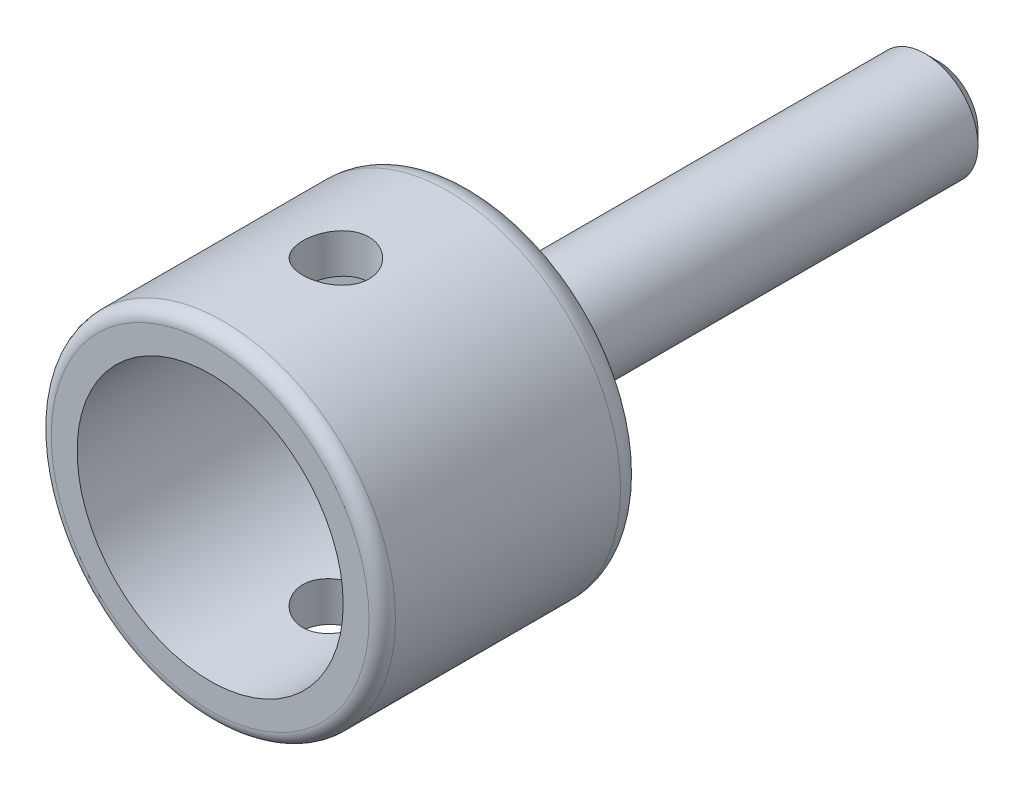
ISO-10303-21;
HEADER;
FILE_DESCRIPTION(('STEP AP214'),'2;1');
FILE_NAME('part.step','',(''),(''),'','','');
FILE_SCHEMA(('AUTOMOTIVE_DESIGN { 1 0 10303 214 1 1 1 1 }'));
ENDSEC;
DATA;
#1=APPLICATION_CONTEXT('core data for automotive mechanical design processes');
#2=APPLICATION_PROTOCOL_DEFINITION('international standard','automotive_design',2000,#1);
#3=PRODUCT_CONTEXT('',#1,'mechanical');
#4=PRODUCT('Part','Part','',(#3));
#5=PRODUCT_RELATED_PRODUCT_CATEGORY('part','',(#4));
#6=PRODUCT_DEFINITION_FORMATION('','',#4);
#7=PRODUCT_DEFINITION_CONTEXT('part definition',#1,'design');
#8=PRODUCT_DEFINITION('design','',#6,#7);
#9=PRODUCT_DEFINITION_SHAPE('','',#8);
#10=(LENGTH_UNIT() NAMED_UNIT(*) SI_UNIT(.MILLI.,.METRE.));
#11=(NAMED_UNIT(*) PLANE_ANGLE_UNIT() SI_UNIT($,.RADIAN.));
#12=(NAMED_UNIT(*) SI_UNIT($,.STERADIAN.) SOLID_ANGLE_UNIT());
#13=UNCERTAINTY_MEASURE_WITH_UNIT(LENGTH_MEASURE(1.E-05),#10,'distance_accuracy_value','');
#14=(GEOMETRIC_REPRESENTATION_CONTEXT(3) GLOBAL_UNCERTAINTY_ASSIGNED_CONTEXT((#13)) GLOBAL_UNIT_ASSIGNED_CONTEXT((#10,
#11,#12)) REPRESENTATION_CONTEXT('',''));
#15=CARTESIAN_POINT('',(0.,0.,0.));
#16=DIRECTION('',(0.,0.,1.));
#17=DIRECTION('',(1.,0.,0.));
#18=AXIS2_PLACEMENT_3D('',#15,#16,#17);
#19=CARTESIAN_POINT('',(0.,0.,20.));
#20=DIRECTION('',(0.,0.,-1.));
#21=DIRECTION('',(-1.,0.,0.));
#22=AXIS2_PLACEMENT_3D('',#19,#20,#21);
#23=CYLINDRICAL_SURFACE('',#22,13.);
#24=CARTESIAN_POINT('',(0.,-13.,13.));
#25=CARTESIAN_POINT('',(0.139052660180754,-12.9999974610984,12.9999947587803));
#26=CARTESIAN_POINT('',(0.278172773072155,-12.9977459806996,12.988359412702));
#27=CARTESIAN_POINT('',(0.552488133091361,-12.9889814495606,12.9421580551378));
#28=CARTESIAN_POINT('',(0.687680044894599,-12.9824648818705,12.907573119314));
#29=CARTESIAN_POINT('',(0.950132537462372,-12.9658986493339,12.8165744195119));
#30=CARTESIAN_POINT('',(1.07740031971374,-12.9558522492613,12.7601808217264));
#31=CARTESIAN_POINT('',(1.32065723842359,-12.9333215487838,12.6272238720737));
#32=CARTESIAN_POINT('',(1.43664719548844,-12.9208374259537,12.5506619892138));
#33=CARTESIAN_POINT('',(1.65552432974222,-12.8946323002435,12.3785208342922));
#34=CARTESIAN_POINT('',(1.75824929536754,-12.8808989548617,12.2827371685489));
#35=CARTESIAN_POINT('',(1.94627668615617,-12.8538341361733,12.0753109628053));
#36=CARTESIAN_POINT('',(2.03157781945352,-12.8405026927278,11.9636672479234));
#37=CARTESIAN_POINT('',(2.18301679620621,-12.8156309401952,11.7265360046422));
#38=CARTESIAN_POINT('',(2.24898851450226,-12.8041065326509,11.6009405688997));
#39=CARTESIAN_POINT('',(2.35883220315187,-12.7843281256073,11.3401900899734));
#40=CARTESIAN_POINT('',(2.40270618335278,-12.7760738286974,11.2050359174576));
#41=CARTESIAN_POINT('',(2.46658610457138,-12.7638947012764,10.9307438082808));
#42=CARTESIAN_POINT('',(2.48687558791542,-12.7599184822057,10.7916742333029));
#43=CARTESIAN_POINT('',(2.50389090184761,-12.7565908775945,10.51205236308));
#44=CARTESIAN_POINT('',(2.50061895687192,-12.7572390554642,10.3715002090564));
#45=CARTESIAN_POINT('',(2.47083395608554,-12.763040258418,10.0949647768379));
#46=CARTESIAN_POINT('',(2.44464430650054,-12.7681305946622,9.95894515523523));
#47=CARTESIAN_POINT('',(2.37027708135778,-12.7821440039021,9.69326701688442));
#48=CARTESIAN_POINT('',(2.32209852760331,-12.7910672474073,9.56360878341274));
#49=CARTESIAN_POINT('',(2.20480765459312,-12.8118060352358,9.31339305618049));
#50=CARTESIAN_POINT('',(2.13556565597228,-12.8236394070727,9.19289788949199));
#51=CARTESIAN_POINT('',(1.97820505089348,-12.848853471063,8.96511502886143));
#52=CARTESIAN_POINT('',(1.89008443268647,-12.8622343280499,8.85782874440831));
#53=CARTESIAN_POINT('',(1.69572891132668,-12.889308238097,8.65764146577918));
#54=CARTESIAN_POINT('',(1.58921761155993,-12.9030027865394,8.5650088099632));
#55=CARTESIAN_POINT('',(1.36202665615399,-12.9289572102898,8.39888449269947));
#56=CARTESIAN_POINT('',(1.24134684412448,-12.9412170697587,8.32539304255885));
#57=CARTESIAN_POINT('',(0.988957762488794,-12.9629474861032,8.19959395296034));
#58=CARTESIAN_POINT('',(0.857233713043068,-12.9724142260635,8.14731526538283));
#59=CARTESIAN_POINT('',(0.586650569197115,-12.9874624721642,8.06570257665309));
#60=CARTESIAN_POINT('',(0.447792274642338,-12.993044412827,8.03636600933479));
#61=CARTESIAN_POINT('',(0.169189915144616,-12.9996341283048,8.00184623384643));
#62=CARTESIAN_POINT('',(0.0294929779953189,-13.0007114935454,7.99629552815895));
#63=CARTESIAN_POINT('',(-0.248832636592824,-12.9983632998844,8.00851777719664));
#64=CARTESIAN_POINT('',(-0.387461368986751,-12.994937974206,8.02628952390234));
#65=CARTESIAN_POINT('',(-0.658542242580223,-12.9840126871957,8.08434674399503));
#66=CARTESIAN_POINT('',(-0.791035903724995,-12.976546573136,8.12444527842575));
#67=CARTESIAN_POINT('',(-1.0474195560019,-12.9583735448858,8.22581478012444));
#68=CARTESIAN_POINT('',(-1.1713089389197,-12.9476664018813,8.28708724229727));
#69=CARTESIAN_POINT('',(-1.40852868267246,-12.924025465347,8.42987174317475));
#70=CARTESIAN_POINT('',(-1.52172218526331,-12.9110676225358,8.51160709153679));
#71=CARTESIAN_POINT('',(-1.73291860543103,-12.8844225517876,8.69269622349735));
#72=CARTESIAN_POINT('',(-1.83092002380893,-12.8707352520445,8.79205174383397));
#73=CARTESIAN_POINT('',(-2.01035510164863,-12.8439416383922,9.00722816139603));
#74=CARTESIAN_POINT('',(-2.09153739238512,-12.8308461515727,9.12326025028297));
#75=CARTESIAN_POINT('',(-2.23325948833318,-12.8069410375943,9.36753032427334));
#76=CARTESIAN_POINT('',(-2.29380008432373,-12.7961313228739,9.49576784154856));
#77=CARTESIAN_POINT('',(-2.39216884187718,-12.7781075731774,9.76018635894623));
#78=CARTESIAN_POINT('',(-2.43010977595278,-12.770875715852,9.89632413346754));
#79=CARTESIAN_POINT('',(-2.48254790543446,-12.7607868732141,10.1731950732065));
#80=CARTESIAN_POINT('',(-2.49704789991889,-12.7579293655635,10.3139276877074));
#81=CARTESIAN_POINT('',(-2.50209511687348,-12.7569402050647,10.5934733559216));
#82=CARTESIAN_POINT('',(-2.49303910212208,-12.7587302704385,10.7322791229674));
#83=CARTESIAN_POINT('',(-2.45210266538041,-12.7666604796616,11.0063499445064));
#84=CARTESIAN_POINT('',(-2.42022239691185,-12.7728005942514,11.1416150228088));
#85=CARTESIAN_POINT('',(-2.33471347717499,-12.7887053259627,11.404536619842));
#86=CARTESIAN_POINT('',(-2.28112994200388,-12.7984624206699,11.5322082959176));
#87=CARTESIAN_POINT('',(-2.15377970785528,-12.8205066533974,11.7768123618909));
#88=CARTESIAN_POINT('',(-2.08001148134918,-12.8327939828824,11.8937439381089));
#89=CARTESIAN_POINT('',(-1.91301563814429,-12.8587559030274,12.1155315746846));
#90=CARTESIAN_POINT('',(-1.81950009853846,-12.8724492796511,12.2201686814821));
#91=CARTESIAN_POINT('',(-1.61626238485009,-12.8995420316146,12.4123973754943));
#92=CARTESIAN_POINT('',(-1.50653649326075,-12.9129413387038,12.4999850420681));
#93=CARTESIAN_POINT('',(-1.27273625734663,-12.9380865705891,12.6564130168556));
#94=CARTESIAN_POINT('',(-1.14853493486942,-12.9498154901243,12.7250663700691));
#95=CARTESIAN_POINT('',(-0.890172259350415,-12.9701319076699,12.8404207923641));
#96=CARTESIAN_POINT('',(-0.756020253294858,-12.9787223099363,12.8871421678689));
#97=CARTESIAN_POINT('',(-0.517923565705546,-12.9900734375022,12.9479845842146));
#98=CARTESIAN_POINT('',(-0.415357439701677,-12.9937745900334,12.9674564897523));
#99=CARTESIAN_POINT('',(-0.208540158514685,-12.9987387895389,12.993465983637));
#100=CARTESIAN_POINT('',(-0.104289050170327,-13.0000019041681,13.000003930898));
#101=CARTESIAN_POINT('',(0.,-13.,13.));
#102=B_SPLINE_CURVE_WITH_KNOTS('',3,(#24,#25,#26,#27,#28,#29,#30,#31,#32,#33,#34,#35,#36,#37,
#38,#39,#40,#41,#42,#43,#44,#45,#46,#47,#48,#49,#50,#51,#52,#53,#54,#55,#56,#57,#58,#59,#60,#61,
#62,#63,#64,#65,#66,#67,#68,#69,#70,#71,#72,#73,#74,#75,#76,#77,#78,#79,#80,#81,#82,#83,#84,#85,
#86,#87,#88,#89,#90,#91,#92,#93,#94,#95,#96,#97,#98,#99,#100,#101),.UNSPECIFIED.,.T.,.F.,(4,2,2,
2,2,2,2,2,2,2,2,2,2,2,2,2,2,2,2,2,2,2,2,2,2,2,2,2,2,2,2,2,2,2,2,2,2,2,4),(0.,0.416776540572571,
0.833897184796517,1.25063304157329,1.66733855274582,2.08873532404099,2.51016332788524,
2.93511361824241,3.36002525127149,3.77977378984828,4.19948270045458,4.61336264699441,
5.02726100716069,5.44376099870308,5.86030539553681,6.28376393575654,6.70722715049957,
7.13126639340045,7.55525819906331,7.9726750569953,8.3900702950831,8.80402218494166,
9.21800330627654,9.63671570954056,10.0554694062924,10.480090247665,10.9046948200739,
11.3271624654498,11.7495796603136,12.1649281712355,12.5802738884444,12.9947605928499,
13.4092786732858,13.8303190431965,14.2514561202698,14.6766136027338,15.1013766593073,
15.4139664054683,15.7265474772226),.UNSPECIFIED.);
#103=CARTESIAN_POINT('',(0.,-13.,13.));
#104=VERTEX_POINT('',#103);
#105=EDGE_CURVE('E91',#104,#104,#102,.T.);
#106=ORIENTED_EDGE('',*,*,#105,.T.);
#107=EDGE_LOOP('',(#106));
#108=FACE_BOUND('',#107,.T.);
#109=CARTESIAN_POINT('',(0.,13.,13.));
#110=CARTESIAN_POINT('',(-0.139052660180754,12.9999974610984,12.9999947587803));
#111=CARTESIAN_POINT('',(-0.278172773072155,12.9977459806996,12.988359412702));
#112=CARTESIAN_POINT('',(-0.552488133091361,12.9889814495606,12.9421580551378));
#113=CARTESIAN_POINT('',(-0.687680044894599,12.9824648818705,12.907573119314));
#114=CARTESIAN_POINT('',(-0.950132537462372,12.9658986493339,12.8165744195119));
#115=CARTESIAN_POINT('',(-1.07740031971374,12.9558522492613,12.7601808217264));
#116=CARTESIAN_POINT('',(-1.32065723842359,12.9333215487838,12.6272238720737));
#117=CARTESIAN_POINT('',(-1.43664719548844,12.9208374259537,12.5506619892138));
#118=CARTESIAN_POINT('',(-1.65552432974222,12.8946323002435,12.3785208342922));
#119=CARTESIAN_POINT('',(-1.75824929536754,12.8808989548617,12.2827371685489));
#120=CARTESIAN_POINT('',(-1.94627668615617,12.8538341361733,12.0753109628053));
#121=CARTESIAN_POINT('',(-2.03157781945352,12.8405026927278,11.9636672479234));
#122=CARTESIAN_POINT('',(-2.18301679620621,12.8156309401952,11.7265360046422));
#123=CARTESIAN_POINT('',(-2.24898851450226,12.8041065326509,11.6009405688997));
#124=CARTESIAN_POINT('',(-2.35883220315187,12.7843281256073,11.3401900899734));
#125=CARTESIAN_POINT('',(-2.40270618335278,12.7760738286974,11.2050359174576));
#126=CARTESIAN_POINT('',(-2.46658610457138,12.7638947012764,10.9307438082808));
#127=CARTESIAN_POINT('',(-2.48687558791542,12.7599184822057,10.7916742333029));
#128=CARTESIAN_POINT('',(-2.50389090184761,12.7565908775945,10.51205236308));
#129=CARTESIAN_POINT('',(-2.50061895687192,12.7572390554642,10.3715002090564));
#130=CARTESIAN_POINT('',(-2.47083395608554,12.763040258418,10.0949647768379));
#131=CARTESIAN_POINT('',(-2.44464430650054,12.7681305946622,9.95894515523523));
#132=CARTESIAN_POINT('',(-2.37027708135778,12.7821440039021,9.69326701688442));
#133=CARTESIAN_POINT('',(-2.32209852760331,12.7910672474073,9.56360878341274));
#134=CARTESIAN_POINT('',(-2.20480765459312,12.8118060352358,9.31339305618049));
#135=CARTESIAN_POINT('',(-2.13556565597228,12.8236394070727,9.19289788949199));
#136=CARTESIAN_POINT('',(-1.97820505089348,12.848853471063,8.96511502886143));
#137=CARTESIAN_POINT('',(-1.89008443268647,12.8622343280499,8.85782874440831));
#138=CARTESIAN_POINT('',(-1.69572891132668,12.889308238097,8.65764146577918));
#139=CARTESIAN_POINT('',(-1.58921761155993,12.9030027865394,8.5650088099632));
#140=CARTESIAN_POINT('',(-1.36202665615399,12.9289572102898,8.39888449269947));
#141=CARTESIAN_POINT('',(-1.24134684412448,12.9412170697587,8.32539304255885));
#142=CARTESIAN_POINT('',(-0.988957762488794,12.9629474861032,8.19959395296034));
#143=CARTESIAN_POINT('',(-0.857233713043068,12.9724142260635,8.14731526538283));
#144=CARTESIAN_POINT('',(-0.586650569197115,12.9874624721642,8.06570257665309));
#145=CARTESIAN_POINT('',(-0.447792274642338,12.993044412827,8.03636600933479));
#146=CARTESIAN_POINT('',(-0.169189915144616,12.9996341283048,8.00184623384643));
#147=CARTESIAN_POINT('',(-0.0294929779953189,13.0007114935454,7.99629552815895));
#148=CARTESIAN_POINT('',(0.248832636592824,12.9983632998844,8.00851777719664));
#149=CARTESIAN_POINT('',(0.387461368986751,12.994937974206,8.02628952390234));
#150=CARTESIAN_POINT('',(0.658542242580223,12.9840126871957,8.08434674399503));
#151=CARTESIAN_POINT('',(0.791035903724995,12.976546573136,8.12444527842575));
#152=CARTESIAN_POINT('',(1.0474195560019,12.9583735448858,8.22581478012444));
#153=CARTESIAN_POINT('',(1.1713089389197,12.9476664018813,8.28708724229727));
#154=CARTESIAN_POINT('',(1.40852868267246,12.924025465347,8.42987174317475));
#155=CARTESIAN_POINT('',(1.52172218526331,12.9110676225358,8.51160709153679));
#156=CARTESIAN_POINT('',(1.73291860543103,12.8844225517876,8.69269622349735));
#157=CARTESIAN_POINT('',(1.83092002380893,12.8707352520445,8.79205174383397));
#158=CARTESIAN_POINT('',(2.01035510164863,12.8439416383922,9.00722816139603));
#159=CARTESIAN_POINT('',(2.09153739238512,12.8308461515727,9.12326025028297));
#160=CARTESIAN_POINT('',(2.23325948833318,12.8069410375943,9.36753032427334));
#161=CARTESIAN_POINT('',(2.29380008432373,12.7961313228739,9.49576784154856));
#162=CARTESIAN_POINT('',(2.39216884187718,12.7781075731774,9.76018635894623));
#163=CARTESIAN_POINT('',(2.43010977595278,12.770875715852,9.89632413346754));
#164=CARTESIAN_POINT('',(2.48254790543446,12.7607868732141,10.1731950732065));
#165=CARTESIAN_POINT('',(2.49704789991889,12.7579293655635,10.3139276877074));
#166=CARTESIAN_POINT('',(2.50209511687348,12.7569402050647,10.5934733559216));
#167=CARTESIAN_POINT('',(2.49303910212208,12.7587302704385,10.7322791229674));
#168=CARTESIAN_POINT('',(2.45210266538041,12.7666604796616,11.0063499445064));
#169=CARTESIAN_POINT('',(2.42022239691185,12.7728005942514,11.1416150228088));
#170=CARTESIAN_POINT('',(2.33471347717499,12.7887053259627,11.404536619842));
#171=CARTESIAN_POINT('',(2.28112994200388,12.7984624206699,11.5322082959176));
#172=CARTESIAN_POINT('',(2.15377970785528,12.8205066533974,11.7768123618909));
#173=CARTESIAN_POINT('',(2.08001148134918,12.8327939828824,11.8937439381089));
#174=CARTESIAN_POINT('',(1.91301563814429,12.8587559030274,12.1155315746846));
#175=CARTESIAN_POINT('',(1.81950009853846,12.8724492796511,12.2201686814821));
#176=CARTESIAN_POINT('',(1.61626238485009,12.8995420316146,12.4123973754943));
#177=CARTESIAN_POINT('',(1.50653649326075,12.9129413387038,12.4999850420681));
#178=CARTESIAN_POINT('',(1.27273625734663,12.9380865705891,12.6564130168556));
#179=CARTESIAN_POINT('',(1.14853493486942,12.9498154901243,12.7250663700691));
#180=CARTESIAN_POINT('',(0.890172259350415,12.9701319076699,12.8404207923641));
#181=CARTESIAN_POINT('',(0.756020253294858,12.9787223099363,12.8871421678689));
#182=CARTESIAN_POINT('',(0.517923565705546,12.9900734375022,12.9479845842146));
#183=CARTESIAN_POINT('',(0.415357439701677,12.9937745900334,12.9674564897523));
#184=CARTESIAN_POINT('',(0.208540158514685,12.9987387895389,12.993465983637));
#185=CARTESIAN_POINT('',(0.104289050170327,13.0000019041681,13.000003930898));
#186=CARTESIAN_POINT('',(0.,13.,13.));
#187=B_SPLINE_CURVE_WITH_KNOTS('',3,(#109,#110,#111,#112,#113,#114,#115,#116,#117,#118,#119,
#120,#121,#122,#123,#124,#125,#126,#127,#128,#129,#130,#131,#132,#133,#134,#135,#136,#137,#138,
#139,#140,#141,#142,#143,#144,#145,#146,#147,#148,#149,#150,#151,#152,#153,#154,#155,#156,#157,
#158,#159,#160,#161,#162,#163,#164,#165,#166,#167,#168,#169,#170,#171,#172,#173,#174,#175,#176,
#177,#178,#179,#180,#181,#182,#183,#184,#185,#186),.UNSPECIFIED.,.T.,.F.,(4,2,2,2,2,2,2,2,2,2,2,
2,2,2,2,2,2,2,2,2,2,2,2,2,2,2,2,2,2,2,2,2,2,2,2,2,2,2,4),(0.,0.416776540572571,
0.833897184796517,1.25063304157329,1.66733855274582,2.08873532404099,2.51016332788524,
2.93511361824241,3.36002525127149,3.77977378984828,4.19948270045458,4.61336264699441,
5.02726100716069,5.44376099870308,5.86030539553681,6.28376393575654,6.70722715049957,
7.13126639340045,7.55525819906331,7.9726750569953,8.3900702950831,8.80402218494166,
9.21800330627654,9.63671570954056,10.0554694062924,10.480090247665,10.9046948200739,
11.3271624654498,11.7495796603136,12.1649281712355,12.5802738884444,12.9947605928499,
13.4092786732858,13.8303190431965,14.2514561202698,14.6766136027338,15.1013766593073,
15.4139664054683,15.7265474772226),.UNSPECIFIED.);
#188=CARTESIAN_POINT('',(0.,13.,13.));
#189=VERTEX_POINT('',#188);
#190=EDGE_CURVE('E84',#189,#189,#187,.T.);
#191=ORIENTED_EDGE('',*,*,#190,.T.);
#192=EDGE_LOOP('',(#191));
#193=FACE_BOUND('',#192,.T.);
#194=CARTESIAN_POINT('',(0.,0.,19.));
#195=DIRECTION('',(0.,0.,1.));
#196=DIRECTION('',(1.,0.,0.));
#197=AXIS2_PLACEMENT_3D('',#194,#195,#196);
#198=CIRCLE('',#197,13.);
#199=CARTESIAN_POINT('',(13.,0.,19.));
#200=VERTEX_POINT('',#199);
#201=EDGE_CURVE('E10',#200,#200,#198,.F.);
#202=ORIENTED_EDGE('',*,*,#201,.T.);
#203=EDGE_LOOP('',(#202));
#204=FACE_BOUND('',#203,.T.);
#205=CARTESIAN_POINT('',(0.,0.,2.));
#206=DIRECTION('',(0.,0.,1.));
#207=DIRECTION('',(1.,0.,0.));
#208=AXIS2_PLACEMENT_3D('',#205,#206,#207);
#209=CIRCLE('',#208,13.);
#210=CARTESIAN_POINT('',(13.,0.,2.));
#211=VERTEX_POINT('',#210);
#212=EDGE_CURVE('E129',#211,#211,#209,.T.);
#213=ORIENTED_EDGE('',*,*,#212,.T.);
#214=EDGE_LOOP('',(#213));
#215=FACE_BOUND('',#214,.T.);
#216=ADVANCED_FACE('F38',(#108,#193,#204,#215),#23,.T.);
#217=CARTESIAN_POINT('',(0.,0.,20.));
#218=DIRECTION('',(0.,0.,1.));
#219=DIRECTION('',(1.,0.,0.));
#220=AXIS2_PLACEMENT_3D('',#217,#218,#219);
#221=PLANE('',#220);
#222=CARTESIAN_POINT('',(0.,0.,20.));
#223=DIRECTION('',(0.,0.,1.));
#224=DIRECTION('',(1.,0.,0.));
#225=AXIS2_PLACEMENT_3D('',#222,#223,#224);
#226=CIRCLE('',#225,12.);
#227=CARTESIAN_POINT('',(12.,0.,20.));
#228=VERTEX_POINT('',#227);
#229=EDGE_CURVE('E52',#228,#228,#226,.T.);
#230=ORIENTED_EDGE('',*,*,#229,.T.);
#231=EDGE_LOOP('',(#230));
#232=FACE_BOUND('',#231,.T.);
#233=CARTESIAN_POINT('',(0.,0.,20.));
#234=DIRECTION('',(0.,0.,1.));
#235=DIRECTION('',(1.,0.,0.));
#236=AXIS2_PLACEMENT_3D('',#233,#234,#235);
#237=CIRCLE('',#236,10.05);
#238=CARTESIAN_POINT('',(10.05,0.,20.));
#239=VERTEX_POINT('',#238);
#240=EDGE_CURVE('E149',#239,#239,#237,.T.);
#241=ORIENTED_EDGE('',*,*,#240,.F.);
#242=EDGE_LOOP('',(#241));
#243=FACE_BOUND('',#242,.T.);
#244=ADVANCED_FACE('F100',(#232,#243),#221,.T.);
#245=CARTESIAN_POINT('',(0.,0.,0.));
#246=DIRECTION('',(0.,0.,1.));
#247=DIRECTION('',(1.,0.,0.));
#248=AXIS2_PLACEMENT_3D('',#245,#246,#247);
#249=PLANE('',#248);
#250=CARTESIAN_POINT('',(0.,0.,0.));
#251=DIRECTION('',(0.,0.,1.));
#252=DIRECTION('',(1.,0.,0.));
#253=AXIS2_PLACEMENT_3D('',#250,#251,#252);
#254=CIRCLE('',#253,6.);
#255=CARTESIAN_POINT('',(6.,0.,0.));
#256=VERTEX_POINT('',#255);
#257=EDGE_CURVE('E134',#256,#256,#254,.T.);
#258=ORIENTED_EDGE('',*,*,#257,.T.);
#259=EDGE_LOOP('',(#258));
#260=FACE_BOUND('',#259,.T.);
#261=CARTESIAN_POINT('',(0.,0.,0.));
#262=DIRECTION('',(0.,0.,1.));
#263=DIRECTION('',(1.,0.,0.));
#264=AXIS2_PLACEMENT_3D('',#261,#262,#263);
#265=CIRCLE('',#264,11.);
#266=CARTESIAN_POINT('',(11.,0.,0.));
#267=VERTEX_POINT('',#266);
#268=EDGE_CURVE('E140',#267,#267,#265,.F.);
#269=ORIENTED_EDGE('',*,*,#268,.T.);
#270=EDGE_LOOP('',(#269));
#271=FACE_BOUND('',#270,.T.);
#272=ADVANCED_FACE('F102',(#260,#271),#249,.F.);
#273=CARTESIAN_POINT('',(0.,0.,5.));
#274=DIRECTION('',(0.,0.,1.));
#275=DIRECTION('',(1.,0.,0.));
#276=AXIS2_PLACEMENT_3D('',#273,#274,#275);
#277=CYLINDRICAL_SURFACE('',#276,10.05);
#278=CARTESIAN_POINT('',(0.,-10.05,13.));
#279=CARTESIAN_POINT('',(-0.138149120244324,-10.0499976495007,12.9999960831279));
#280=CARTESIAN_POINT('',(-0.276342133133085,-10.047123061901,12.9885103640532));
#281=CARTESIAN_POINT('',(-0.548769025027616,-10.0359342655743,12.9429388751234));
#282=CARTESIAN_POINT('',(-0.683000589472911,-10.0276169400908,12.9088401558971));
#283=CARTESIAN_POINT('',(-0.943531031722718,-10.0064638944718,12.8192032991761));
#284=CARTESIAN_POINT('',(-1.06983917550875,-9.9936335726432,12.7636907685858));
#285=CARTESIAN_POINT('',(-1.31134994617553,-9.96482173754971,12.6328918096496));
#286=CARTESIAN_POINT('',(-1.42655222531553,-9.948840125661,12.5576047624096));
#287=CARTESIAN_POINT('',(-1.64493217751513,-9.91509674875052,12.3877709903389));
#288=CARTESIAN_POINT('',(-1.74785093613268,-9.89730773811109,12.2928967376843));
#289=CARTESIAN_POINT('',(-1.93649227636482,-9.86213595603868,12.0872830050492));
#290=CARTESIAN_POINT('',(-2.02221293495779,-9.84475323022661,11.976541753256));
#291=CARTESIAN_POINT('',(-2.17523929701294,-9.81208773347641,11.7403312315224));
#292=CARTESIAN_POINT('',(-2.24225595887269,-9.79683956545783,11.6146694893272));
#293=CARTESIAN_POINT('',(-2.35411338624094,-9.77056672328167,11.3534232030805));
#294=CARTESIAN_POINT('',(-2.39895765845211,-9.75954138131983,11.2178402320298));
#295=CARTESIAN_POINT('',(-2.46431522726038,-9.7432424416228,10.9434456330097));
#296=CARTESIAN_POINT('',(-2.48529376486338,-9.73785902994977,10.8047514940129));
#297=CARTESIAN_POINT('',(-2.50377340970003,-9.73312473372563,10.5257159472865));
#298=CARTESIAN_POINT('',(-2.50127829617524,-9.73377287809799,10.3853748083564));
#299=CARTESIAN_POINT('',(-2.47325279579146,-9.74092971720534,10.1105901435097));
#300=CARTESIAN_POINT('',(-2.44827620085772,-9.74729751054116,9.9760858936246));
#301=CARTESIAN_POINT('',(-2.37687989643218,-9.76495168511673,9.71323922778809));
#302=CARTESIAN_POINT('',(-2.33045867284167,-9.77623841365488,9.58489724763042));
#303=CARTESIAN_POINT('',(-2.21701737777807,-9.80258845479471,9.33653029118933));
#304=CARTESIAN_POINT('',(-2.14979582120104,-9.81768842961033,9.2166013959207));
#305=CARTESIAN_POINT('',(-1.99680297830773,-9.849942805406,8.9895270253797));
#306=CARTESIAN_POINT('',(-1.91102847570783,-9.86709756236658,8.88238377159171));
#307=CARTESIAN_POINT('',(-1.72049333318709,-9.90212233731057,8.68074787963906));
#308=CARTESIAN_POINT('',(-1.61526520789735,-9.91999887837004,8.58669757353141));
#309=CARTESIAN_POINT('',(-1.3903166828846,-9.9540162544652,8.41749493638428));
#310=CARTESIAN_POINT('',(-1.27059584924895,-9.97015703750486,8.34234317137576));
#311=CARTESIAN_POINT('',(-1.01943306717815,-9.99896331374889,8.21291074431665));
#312=CARTESIAN_POINT('',(-0.887952940901935,-10.0116168996541,8.15870134451893));
#313=CARTESIAN_POINT('',(-0.617361288772491,-10.0319364051668,8.07327715035508));
#314=CARTESIAN_POINT('',(-0.47825121315644,-10.0396032690711,8.04205800235574));
#315=CARTESIAN_POINT('',(-0.200130869073605,-10.048945967306,8.00417468239634));
#316=CARTESIAN_POINT('',(-0.0612074768799949,-10.0507687562964,7.9969080671832));
#317=CARTESIAN_POINT('',(0.21587027791211,-10.0486361955606,8.00548456342798));
#318=CARTESIAN_POINT('',(0.354024707904037,-10.0446813604641,8.02132561661888));
#319=CARTESIAN_POINT('',(0.623553484681897,-10.0315320359526,8.07517106229855));
#320=CARTESIAN_POINT('',(0.754997512660056,-10.0224151641553,8.11284732870442));
#321=CARTESIAN_POINT('',(1.00969314222251,-9.99996898205656,8.2089193622748));
#322=CARTESIAN_POINT('',(1.13294391975328,-9.9866392488112,8.26731720982395));
#323=CARTESIAN_POINT('',(1.37015530788384,-9.95689351573582,8.40434592576596));
#324=CARTESIAN_POINT('',(1.48391415025034,-9.94042731066938,8.48331491688241));
#325=CARTESIAN_POINT('',(1.69677945293209,-9.90631519818683,8.65881154905883));
#326=CARTESIAN_POINT('',(1.79588340572825,-9.88866908963216,8.75534218871031));
#327=CARTESIAN_POINT('',(1.97910418086509,-9.85365789066487,8.96601789068565));
#328=CARTESIAN_POINT('',(2.06279861076286,-9.83631003075174,9.08053377768836));
#329=CARTESIAN_POINT('',(2.20978147219653,-9.80433811141746,9.32234099717649));
#330=CARTESIAN_POINT('',(2.2730708114297,-9.78971393084877,9.44963176105563));
#331=CARTESIAN_POINT('',(2.37697681702319,-9.76500562544714,9.71269094582249));
#332=CARTESIAN_POINT('',(2.41772782917239,-9.75489466960332,9.848403649642));
#333=CARTESIAN_POINT('',(2.47575653897304,-9.74033066203439,10.1250435057745));
#334=CARTESIAN_POINT('',(2.49303930941649,-9.73587638759938,10.2659695244328));
#335=CARTESIAN_POINT('',(2.50337787703285,-9.73322260519535,10.5447391318368));
#336=CARTESIAN_POINT('',(2.49710853550655,-9.7348488596014,10.682556436311));
#337=CARTESIAN_POINT('',(2.46206386456689,-9.74377042341067,10.955102646901));
#338=CARTESIAN_POINT('',(2.43328897878428,-9.75106562106731,11.0898316138404));
#339=CARTESIAN_POINT('',(2.35441691646645,-9.77040646795976,11.3516512462893));
#340=CARTESIAN_POINT('',(2.30444512764144,-9.78242415161759,11.4787818920223));
#341=CARTESIAN_POINT('',(2.18469721242086,-9.80986007111271,11.7229449421722));
#342=CARTESIAN_POINT('',(2.11491836632508,-9.82527877387791,11.8399759569325));
#343=CARTESIAN_POINT('',(1.95541620916133,-9.85827730250421,12.0638816003864));
#344=CARTESIAN_POINT('',(1.86522408606983,-9.87590267986968,12.1704156073417));
#345=CARTESIAN_POINT('',(1.66837075947881,-9.91105533440381,12.3670562962976));
#346=CARTESIAN_POINT('',(1.56170565654069,-9.92858258732408,12.4571590777015));
#347=CARTESIAN_POINT('',(1.33263219480728,-9.96193807017932,12.6199495273657));
#348=CARTESIAN_POINT('',(1.20997642793057,-9.9777303145331,12.6922969753456));
#349=CARTESIAN_POINT('',(0.953862346644192,-10.0054576655997,12.8152302618488));
#350=CARTESIAN_POINT('',(0.820411912991094,-10.0173955550025,12.865831808819));
#351=CARTESIAN_POINT('',(0.572652374673045,-10.0342886183311,12.9362611834159));
#352=CARTESIAN_POINT('',(0.459530932528023,-10.0401400881988,12.960111840281));
#353=CARTESIAN_POINT('',(0.230949770008302,-10.0479966198189,12.9919823025789));
#354=CARTESIAN_POINT('',(0.115490222552351,-10.0500019649759,13.0000032744358));
#355=CARTESIAN_POINT('',(0.,-10.05,13.));
#356=B_SPLINE_CURVE_WITH_KNOTS('',3,(#278,#279,#280,#281,#282,#283,#284,#285,#286,#287,#288,
#289,#290,#291,#292,#293,#294,#295,#296,#297,#298,#299,#300,#301,#302,#303,#304,#305,#306,#307,
#308,#309,#310,#311,#312,#313,#314,#315,#316,#317,#318,#319,#320,#321,#322,#323,#324,#325,#326,
#327,#328,#329,#330,#331,#332,#333,#334,#335,#336,#337,#338,#339,#340,#341,#342,#343,#344,#345,
#346,#347,#348,#349,#350,#351,#352,#353,#354,#355),.UNSPECIFIED.,.T.,.F.,(4,2,2,2,2,2,2,2,2,2,2,
2,2,2,2,2,2,2,2,2,2,2,2,2,2,2,2,2,2,2,2,2,2,2,2,2,2,2,4),(0.,0.414024152539477,
0.828285601650377,1.24205319975281,1.65583374931437,2.07719371916549,2.4986007775494,
2.92619886380052,3.35372930107962,3.77277438167384,4.19175199745518,4.60068304969174,
5.00964297893256,5.42269539215746,5.83581946839407,6.26060204266372,6.68539733809846,
7.11162564712353,7.53777322109372,7.95311727256071,8.36842433038784,8.7776465283381,
9.18690982260024,9.60337864721062,10.0199186493046,10.4465739532333,10.8732102752663,
11.2972753272191,11.7212487005347,12.1331674619149,12.5450781037304,12.9545853907585,
13.3641489343132,13.7842965718423,14.2045438184452,14.6323057517583,15.0597581639,
15.4059005437425,15.7520174168306),.UNSPECIFIED.);
#357=CARTESIAN_POINT('',(0.,-10.05,13.));
#358=VERTEX_POINT('',#357);
#359=EDGE_CURVE('E42',#358,#358,#356,.T.);
#360=ORIENTED_EDGE('',*,*,#359,.T.);
#361=EDGE_LOOP('',(#360));
#362=FACE_BOUND('',#361,.T.);
#363=CARTESIAN_POINT('',(0.,10.05,13.));
#364=CARTESIAN_POINT('',(0.138149120244324,10.0499976495007,12.9999960831279));
#365=CARTESIAN_POINT('',(0.276342133133085,10.047123061901,12.9885103640532));
#366=CARTESIAN_POINT('',(0.548769025027616,10.0359342655743,12.9429388751234));
#367=CARTESIAN_POINT('',(0.683000589472911,10.0276169400908,12.9088401558971));
#368=CARTESIAN_POINT('',(0.943531031722718,10.0064638944718,12.8192032991761));
#369=CARTESIAN_POINT('',(1.06983917550875,9.9936335726432,12.7636907685858));
#370=CARTESIAN_POINT('',(1.31134994617553,9.96482173754971,12.6328918096496));
#371=CARTESIAN_POINT('',(1.42655222531553,9.948840125661,12.5576047624096));
#372=CARTESIAN_POINT('',(1.64493217751513,9.91509674875052,12.3877709903389));
#373=CARTESIAN_POINT('',(1.74785093613268,9.89730773811109,12.2928967376843));
#374=CARTESIAN_POINT('',(1.93649227636482,9.86213595603868,12.0872830050492));
#375=CARTESIAN_POINT('',(2.02221293495779,9.84475323022661,11.976541753256));
#376=CARTESIAN_POINT('',(2.17523929701294,9.81208773347641,11.7403312315224));
#377=CARTESIAN_POINT('',(2.24225595887269,9.79683956545783,11.6146694893272));
#378=CARTESIAN_POINT('',(2.35411338624094,9.77056672328167,11.3534232030805));
#379=CARTESIAN_POINT('',(2.39895765845211,9.75954138131983,11.2178402320298));
#380=CARTESIAN_POINT('',(2.46431522726038,9.7432424416228,10.9434456330097));
#381=CARTESIAN_POINT('',(2.48529376486338,9.73785902994977,10.8047514940129));
#382=CARTESIAN_POINT('',(2.50377340970003,9.73312473372563,10.5257159472865));
#383=CARTESIAN_POINT('',(2.50127829617524,9.73377287809799,10.3853748083564));
#384=CARTESIAN_POINT('',(2.47325279579146,9.74092971720534,10.1105901435097));
#385=CARTESIAN_POINT('',(2.44827620085772,9.74729751054116,9.9760858936246));
#386=CARTESIAN_POINT('',(2.37687989643218,9.76495168511673,9.71323922778809));
#387=CARTESIAN_POINT('',(2.33045867284167,9.77623841365488,9.58489724763042));
#388=CARTESIAN_POINT('',(2.21701737777807,9.80258845479471,9.33653029118933));
#389=CARTESIAN_POINT('',(2.14979582120104,9.81768842961033,9.2166013959207));
#390=CARTESIAN_POINT('',(1.99680297830773,9.849942805406,8.9895270253797));
#391=CARTESIAN_POINT('',(1.91102847570783,9.86709756236658,8.88238377159171));
#392=CARTESIAN_POINT('',(1.72049333318709,9.90212233731057,8.68074787963906));
#393=CARTESIAN_POINT('',(1.61526520789735,9.91999887837004,8.58669757353141));
#394=CARTESIAN_POINT('',(1.3903166828846,9.9540162544652,8.41749493638428));
#395=CARTESIAN_POINT('',(1.27059584924895,9.97015703750486,8.34234317137576));
#396=CARTESIAN_POINT('',(1.01943306717815,9.99896331374889,8.21291074431665));
#397=CARTESIAN_POINT('',(0.887952940901935,10.0116168996541,8.15870134451893));
#398=CARTESIAN_POINT('',(0.617361288772491,10.0319364051668,8.07327715035508));
#399=CARTESIAN_POINT('',(0.47825121315644,10.0396032690711,8.04205800235574));
#400=CARTESIAN_POINT('',(0.200130869073605,10.048945967306,8.00417468239634));
#401=CARTESIAN_POINT('',(0.0612074768799949,10.0507687562964,7.9969080671832));
#402=CARTESIAN_POINT('',(-0.21587027791211,10.0486361955606,8.00548456342798));
#403=CARTESIAN_POINT('',(-0.354024707904037,10.0446813604641,8.02132561661888));
#404=CARTESIAN_POINT('',(-0.623553484681897,10.0315320359526,8.07517106229855));
#405=CARTESIAN_POINT('',(-0.754997512660056,10.0224151641553,8.11284732870442));
#406=CARTESIAN_POINT('',(-1.00969314222251,9.99996898205656,8.2089193622748));
#407=CARTESIAN_POINT('',(-1.13294391975328,9.9866392488112,8.26731720982395));
#408=CARTESIAN_POINT('',(-1.37015530788384,9.95689351573582,8.40434592576596));
#409=CARTESIAN_POINT('',(-1.48391415025034,9.94042731066938,8.48331491688241));
#410=CARTESIAN_POINT('',(-1.69677945293209,9.90631519818683,8.65881154905883));
#411=CARTESIAN_POINT('',(-1.79588340572825,9.88866908963216,8.75534218871031));
#412=CARTESIAN_POINT('',(-1.97910418086509,9.85365789066487,8.96601789068565));
#413=CARTESIAN_POINT('',(-2.06279861076286,9.83631003075174,9.08053377768836));
#414=CARTESIAN_POINT('',(-2.20978147219653,9.80433811141746,9.32234099717649));
#415=CARTESIAN_POINT('',(-2.2730708114297,9.78971393084877,9.44963176105563));
#416=CARTESIAN_POINT('',(-2.37697681702319,9.76500562544714,9.71269094582249));
#417=CARTESIAN_POINT('',(-2.41772782917239,9.75489466960332,9.848403649642));
#418=CARTESIAN_POINT('',(-2.47575653897304,9.74033066203439,10.1250435057745));
#419=CARTESIAN_POINT('',(-2.49303930941649,9.73587638759938,10.2659695244328));
#420=CARTESIAN_POINT('',(-2.50337787703285,9.73322260519535,10.5447391318368));
#421=CARTESIAN_POINT('',(-2.49710853550655,9.7348488596014,10.682556436311));
#422=CARTESIAN_POINT('',(-2.46206386456689,9.74377042341067,10.955102646901));
#423=CARTESIAN_POINT('',(-2.43328897878428,9.75106562106731,11.0898316138404));
#424=CARTESIAN_POINT('',(-2.35441691646645,9.77040646795976,11.3516512462893));
#425=CARTESIAN_POINT('',(-2.30444512764144,9.78242415161759,11.4787818920223));
#426=CARTESIAN_POINT('',(-2.18469721242086,9.80986007111271,11.7229449421722));
#427=CARTESIAN_POINT('',(-2.11491836632508,9.82527877387791,11.8399759569325));
#428=CARTESIAN_POINT('',(-1.95541620916133,9.85827730250421,12.0638816003864));
#429=CARTESIAN_POINT('',(-1.86522408606983,9.87590267986968,12.1704156073417));
#430=CARTESIAN_POINT('',(-1.66837075947881,9.91105533440381,12.3670562962976));
#431=CARTESIAN_POINT('',(-1.56170565654069,9.92858258732408,12.4571590777015));
#432=CARTESIAN_POINT('',(-1.33263219480728,9.96193807017932,12.6199495273657));
#433=CARTESIAN_POINT('',(-1.20997642793057,9.9777303145331,12.6922969753456));
#434=CARTESIAN_POINT('',(-0.953862346644192,10.0054576655997,12.8152302618488));
#435=CARTESIAN_POINT('',(-0.820411912991094,10.0173955550025,12.865831808819));
#436=CARTESIAN_POINT('',(-0.572652374673045,10.0342886183311,12.9362611834159));
#437=CARTESIAN_POINT('',(-0.459530932528023,10.0401400881988,12.960111840281));
#438=CARTESIAN_POINT('',(-0.230949770008302,10.0479966198189,12.9919823025789));
#439=CARTESIAN_POINT('',(-0.115490222552351,10.0500019649759,13.0000032744358));
#440=CARTESIAN_POINT('',(0.,10.05,13.));
#441=B_SPLINE_CURVE_WITH_KNOTS('',3,(#363,#364,#365,#366,#367,#368,#369,#370,#371,#372,#373,
#374,#375,#376,#377,#378,#379,#380,#381,#382,#383,#384,#385,#386,#387,#388,#389,#390,#391,#392,
#393,#394,#395,#396,#397,#398,#399,#400,#401,#402,#403,#404,#405,#406,#407,#408,#409,#410,#411,
#412,#413,#414,#415,#416,#417,#418,#419,#420,#421,#422,#423,#424,#425,#426,#427,#428,#429,#430,
#431,#432,#433,#434,#435,#436,#437,#438,#439,#440),.UNSPECIFIED.,.T.,.F.,(4,2,2,2,2,2,2,2,2,2,2,
2,2,2,2,2,2,2,2,2,2,2,2,2,2,2,2,2,2,2,2,2,2,2,2,2,2,2,4),(0.,0.414024152539477,
0.828285601650377,1.24205319975281,1.65583374931437,2.07719371916549,2.4986007775494,
2.92619886380052,3.35372930107962,3.77277438167384,4.19175199745518,4.60068304969174,
5.00964297893256,5.42269539215746,5.83581946839407,6.26060204266372,6.68539733809846,
7.11162564712353,7.53777322109372,7.95311727256071,8.36842433038784,8.7776465283381,
9.18690982260024,9.60337864721062,10.0199186493046,10.4465739532333,10.8732102752663,
11.2972753272191,11.7212487005347,12.1331674619149,12.5450781037304,12.9545853907585,
13.3641489343132,13.7842965718423,14.2045438184452,14.6323057517583,15.0597581639,
15.4059005437425,15.7520174168306),.UNSPECIFIED.);
#442=CARTESIAN_POINT('',(0.,10.05,13.));
#443=VERTEX_POINT('',#442);
#444=EDGE_CURVE('E61',#443,#443,#441,.T.);
#445=ORIENTED_EDGE('',*,*,#444,.T.);
#446=EDGE_LOOP('',(#445));
#447=FACE_BOUND('',#446,.T.);
#448=CARTESIAN_POINT('',(0.,0.,5.));
#449=DIRECTION('',(0.,0.,1.));
#450=DIRECTION('',(1.,0.,0.));
#451=AXIS2_PLACEMENT_3D('',#448,#449,#450);
#452=CIRCLE('',#451,10.05);
#453=CARTESIAN_POINT('',(10.05,0.,5.));
#454=VERTEX_POINT('',#453);
#455=EDGE_CURVE('E148',#454,#454,#452,.T.);
#456=ORIENTED_EDGE('',*,*,#455,.F.);
#457=EDGE_LOOP('',(#456));
#458=FACE_BOUND('',#457,.T.);
#459=ORIENTED_EDGE('',*,*,#240,.T.);
#460=EDGE_LOOP('',(#459));
#461=FACE_BOUND('',#460,.T.);
#462=ADVANCED_FACE('F67',(#362,#447,#458,#461),#277,.F.);
#463=CARTESIAN_POINT('',(0.,0.,5.));
#464=DIRECTION('',(0.,0.,1.));
#465=DIRECTION('',(1.,0.,0.));
#466=AXIS2_PLACEMENT_3D('',#463,#464,#465);
#467=PLANE('',#466);
#468=ORIENTED_EDGE('',*,*,#455,.T.);
#469=EDGE_LOOP('',(#468));
#470=FACE_BOUND('',#469,.T.);
#471=ADVANCED_FACE('F156',(#470),#467,.T.);
#472=CARTESIAN_POINT('',(0.,0.,-35.));
#473=DIRECTION('',(0.,0.,1.));
#474=DIRECTION('',(1.,0.,0.));
#475=AXIS2_PLACEMENT_3D('',#472,#473,#474);
#476=CYLINDRICAL_SURFACE('',#475,4.);
#477=CARTESIAN_POINT('',(0.,0.,-34.));
#478=DIRECTION('',(0.,0.,-1.));
#479=DIRECTION('',(-1.,0.,0.));
#480=AXIS2_PLACEMENT_3D('',#477,#478,#479);
#481=CIRCLE('',#480,4.);
#482=CARTESIAN_POINT('',(-4.,0.,-34.));
#483=VERTEX_POINT('',#482);
#484=EDGE_CURVE('E58',#483,#483,#481,.F.);
#485=ORIENTED_EDGE('',*,*,#484,.T.);
#486=EDGE_LOOP('',(#485));
#487=FACE_BOUND('',#486,.T.);
#488=CARTESIAN_POINT('',(0.,0.,-2.));
#489=DIRECTION('',(0.,0.,1.));
#490=DIRECTION('',(1.,0.,0.));
#491=AXIS2_PLACEMENT_3D('',#488,#489,#490);
#492=CIRCLE('',#491,4.);
#493=CARTESIAN_POINT('',(4.,0.,-2.));
#494=VERTEX_POINT('',#493);
#495=EDGE_CURVE('E144',#494,#494,#492,.F.);
#496=ORIENTED_EDGE('',*,*,#495,.T.);
#497=EDGE_LOOP('',(#496));
#498=FACE_BOUND('',#497,.T.);
#499=ADVANCED_FACE('F184',(#487,#498),#476,.T.);
#500=CARTESIAN_POINT('',(0.,0.,-35.));
#501=DIRECTION('',(0.,0.,-1.));
#502=DIRECTION('',(-1.,0.,0.));
#503=AXIS2_PLACEMENT_3D('',#500,#501,#502);
#504=PLANE('',#503);
#505=CARTESIAN_POINT('',(0.,0.,-35.));
#506=DIRECTION('',(0.,0.,-1.));
#507=DIRECTION('',(-1.,0.,0.));
#508=AXIS2_PLACEMENT_3D('',#505,#506,#507);
#509=CIRCLE('',#508,3.);
#510=CARTESIAN_POINT('',(-3.,0.,-35.));
#511=VERTEX_POINT('',#510);
#512=EDGE_CURVE('E126',#511,#511,#509,.T.);
#513=ORIENTED_EDGE('',*,*,#512,.T.);
#514=EDGE_LOOP('',(#513));
#515=FACE_BOUND('',#514,.T.);
#516=ADVANCED_FACE('F77',(#515),#504,.T.);
#517=CARTESIAN_POINT('',(0.,0.,-2.));
#518=DIRECTION('',(0.,0.,1.));
#519=DIRECTION('',(1.,0.,0.));
#520=AXIS2_PLACEMENT_3D('',#517,#518,#519);
#521=TOROIDAL_SURFACE('',#520,6.,2.);
#522=ORIENTED_EDGE('',*,*,#257,.F.);
#523=EDGE_LOOP('',(#522));
#524=FACE_BOUND('',#523,.T.);
#525=ORIENTED_EDGE('',*,*,#495,.F.);
#526=EDGE_LOOP('',(#525));
#527=FACE_BOUND('',#526,.T.);
#528=ADVANCED_FACE('F103',(#524,#527),#521,.F.);
#529=CARTESIAN_POINT('',(0.,0.,2.));
#530=DIRECTION('',(0.,0.,1.));
#531=DIRECTION('',(1.,0.,0.));
#532=AXIS2_PLACEMENT_3D('',#529,#530,#531);
#533=TOROIDAL_SURFACE('',#532,11.,2.);
#534=ORIENTED_EDGE('',*,*,#268,.F.);
#535=EDGE_LOOP('',(#534));
#536=FACE_BOUND('',#535,.T.);
#537=ORIENTED_EDGE('',*,*,#212,.F.);
#538=EDGE_LOOP('',(#537));
#539=FACE_BOUND('',#538,.T.);
#540=ADVANCED_FACE('F107',(#536,#539),#533,.T.);
#541=CARTESIAN_POINT('',(0.,0.,-35.));
#542=DIRECTION('',(0.,0.,1.));
#543=DIRECTION('',(1.,0.,0.));
#544=AXIS2_PLACEMENT_3D('',#541,#542,#543);
#545=CONICAL_SURFACE('',#544,3.,0.785398163397443);
#546=ORIENTED_EDGE('',*,*,#484,.F.);
#547=EDGE_LOOP('',(#546));
#548=FACE_BOUND('',#547,.T.);
#549=ORIENTED_EDGE('',*,*,#512,.F.);
#550=EDGE_LOOP('',(#549));
#551=FACE_BOUND('',#550,.T.);
#552=ADVANCED_FACE('F110',(#548,#551),#545,.T.);
#553=CARTESIAN_POINT('',(0.,0.,19.));
#554=DIRECTION('',(0.,0.,1.));
#555=DIRECTION('',(1.,0.,0.));
#556=AXIS2_PLACEMENT_3D('',#553,#554,#555);
#557=TOROIDAL_SURFACE('',#556,12.,1.);
#558=ORIENTED_EDGE('',*,*,#201,.F.);
#559=EDGE_LOOP('',(#558));
#560=FACE_BOUND('',#559,.T.);
#561=ORIENTED_EDGE('',*,*,#229,.F.);
#562=EDGE_LOOP('',(#561));
#563=FACE_BOUND('',#562,.T.);
#564=ADVANCED_FACE('F40',(#560,#563),#557,.T.);
#565=CARTESIAN_POINT('',(0.,-20.,10.5));
#566=DIRECTION('',(0.,1.,0.));
#567=DIRECTION('',(0.,0.,1.));
#568=AXIS2_PLACEMENT_3D('',#565,#566,#567);
#569=CYLINDRICAL_SURFACE('',#568,2.5);
#570=ORIENTED_EDGE('',*,*,#444,.F.);
#571=EDGE_LOOP('',(#570));
#572=FACE_BOUND('',#571,.T.);
#573=ORIENTED_EDGE('',*,*,#190,.F.);
#574=EDGE_LOOP('',(#573));
#575=FACE_BOUND('',#574,.T.);
#576=ADVANCED_FACE('F75',(#572,#575),#569,.F.);
#577=ORIENTED_EDGE('',*,*,#359,.F.);
#578=EDGE_LOOP('',(#577));
#579=FACE_BOUND('',#578,.T.);
#580=ORIENTED_EDGE('',*,*,#105,.F.);
#581=EDGE_LOOP('',(#580));
#582=FACE_BOUND('',#581,.T.);
#583=ADVANCED_FACE('F71',(#579,#582),#569,.F.);
#584=CLOSED_SHELL('',(#216,#244,#272,#462,#471,#499,#516,#528,#540,#552,#564,#576,#583));
#585=MANIFOLD_SOLID_BREP('B2',#584);
#586=ADVANCED_BREP_SHAPE_REPRESENTATION('',(#18,#585),#14);
#587=SHAPE_DEFINITION_REPRESENTATION(#9,#586);
ENDSEC;
END-ISO-10303-21;
